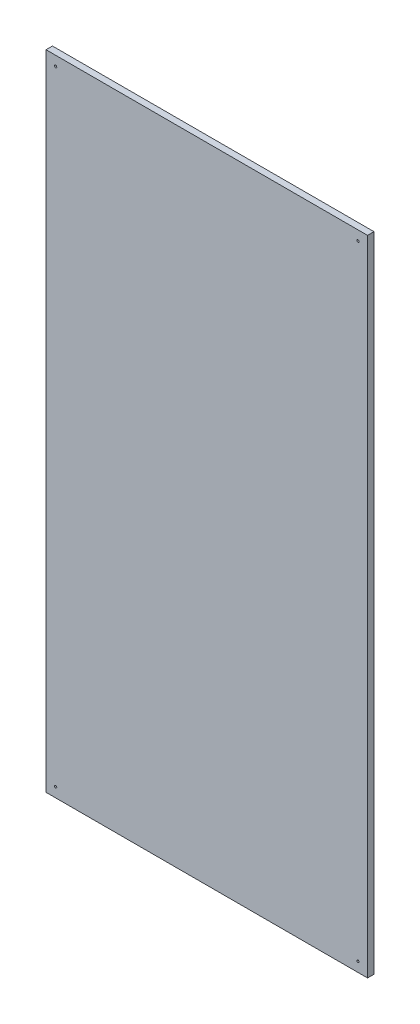
ISO-10303-21;
HEADER;
FILE_DESCRIPTION(('STEP AP214'),'2;1');
FILE_NAME('part.step','',(''),(''),'','','');
FILE_SCHEMA(('AUTOMOTIVE_DESIGN { 1 0 10303 214 1 1 1 1 }'));
ENDSEC;
DATA;
#1=APPLICATION_CONTEXT('core data for automotive mechanical design processes');
#2=APPLICATION_PROTOCOL_DEFINITION('international standard','automotive_design',2000,#1);
#3=PRODUCT_CONTEXT('',#1,'mechanical');
#4=PRODUCT('Part','Part','',(#3));
#5=PRODUCT_RELATED_PRODUCT_CATEGORY('part','',(#4));
#6=PRODUCT_DEFINITION_FORMATION('','',#4);
#7=PRODUCT_DEFINITION_CONTEXT('part definition',#1,'design');
#8=PRODUCT_DEFINITION('design','',#6,#7);
#9=PRODUCT_DEFINITION_SHAPE('','',#8);
#10=(LENGTH_UNIT() NAMED_UNIT(*) SI_UNIT(.MILLI.,.METRE.));
#11=(NAMED_UNIT(*) PLANE_ANGLE_UNIT() SI_UNIT($,.RADIAN.));
#12=(NAMED_UNIT(*) SI_UNIT($,.STERADIAN.) SOLID_ANGLE_UNIT());
#13=UNCERTAINTY_MEASURE_WITH_UNIT(LENGTH_MEASURE(1.E-05),#10,'distance_accuracy_value','');
#14=(GEOMETRIC_REPRESENTATION_CONTEXT(3) GLOBAL_UNCERTAINTY_ASSIGNED_CONTEXT((#13)) GLOBAL_UNIT_ASSIGNED_CONTEXT((#10,
#11,#12)) REPRESENTATION_CONTEXT('',''));
#15=CARTESIAN_POINT('',(0.,0.,0.));
#16=DIRECTION('',(0.,0.,1.));
#17=DIRECTION('',(1.,0.,0.));
#18=AXIS2_PLACEMENT_3D('',#15,#16,#17);
#19=CARTESIAN_POINT('',(0.,0.,10.));
#20=DIRECTION('',(0.,0.,1.));
#21=DIRECTION('',(1.,0.,0.));
#22=AXIS2_PLACEMENT_3D('',#19,#20,#21);
#23=PLANE('',#22);
#24=CARTESIAN_POINT('',(-235.,-485.,10.));
#25=DIRECTION('',(0.,0.,1.));
#26=DIRECTION('',(1.,0.,0.));
#27=AXIS2_PLACEMENT_3D('',#24,#25,#26);
#28=CIRCLE('',#27,1.75000000000001);
#29=CARTESIAN_POINT('',(-233.25,-485.,10.));
#30=VERTEX_POINT('',#29);
#31=EDGE_CURVE('E131',#30,#30,#28,.T.);
#32=ORIENTED_EDGE('',*,*,#31,.F.);
#33=EDGE_LOOP('',(#32));
#34=FACE_BOUND('',#33,.T.);
#35=CARTESIAN_POINT('',(235.,485.,10.));
#36=DIRECTION('',(0.,0.,1.));
#37=DIRECTION('',(1.,0.,0.));
#38=AXIS2_PLACEMENT_3D('',#35,#36,#37);
#39=CIRCLE('',#38,1.75000000000001);
#40=CARTESIAN_POINT('',(236.75,485.,10.));
#41=VERTEX_POINT('',#40);
#42=EDGE_CURVE('E110',#41,#41,#39,.T.);
#43=ORIENTED_EDGE('',*,*,#42,.F.);
#44=EDGE_LOOP('',(#43));
#45=FACE_BOUND('',#44,.T.);
#46=DIRECTION('',(0.,1.,0.));
#47=VECTOR('',#46,1.);
#48=CARTESIAN_POINT('',(250.,500.000000000001,10.));
#49=LINE('',#48,#47);
#50=CARTESIAN_POINT('',(250.,-499.999999999999,10.));
#51=VERTEX_POINT('',#50);
#52=CARTESIAN_POINT('',(250.,500.000000000001,10.));
#53=VERTEX_POINT('',#52);
#54=EDGE_CURVE('E95',#51,#53,#49,.T.);
#55=ORIENTED_EDGE('',*,*,#54,.T.);
#56=DIRECTION('',(-1.,0.,0.));
#57=VECTOR('',#56,1.);
#58=CARTESIAN_POINT('',(-250.,500.000000000001,10.));
#59=LINE('',#58,#57);
#60=CARTESIAN_POINT('',(-250.,500.000000000001,10.));
#61=VERTEX_POINT('',#60);
#62=EDGE_CURVE('E90',#53,#61,#59,.T.);
#63=ORIENTED_EDGE('',*,*,#62,.T.);
#64=DIRECTION('',(0.,-1.,0.));
#65=VECTOR('',#64,1.);
#66=CARTESIAN_POINT('',(-250.,500.000000000001,10.));
#67=LINE('',#66,#65);
#68=CARTESIAN_POINT('',(-250.,-499.999999999999,10.));
#69=VERTEX_POINT('',#68);
#70=EDGE_CURVE('E93',#61,#69,#67,.T.);
#71=ORIENTED_EDGE('',*,*,#70,.T.);
#72=DIRECTION('',(1.,0.,0.));
#73=VECTOR('',#72,1.);
#74=CARTESIAN_POINT('',(-250.,-499.999999999999,10.));
#75=LINE('',#74,#73);
#76=EDGE_CURVE('E60',#69,#51,#75,.T.);
#77=ORIENTED_EDGE('',*,*,#76,.T.);
#78=EDGE_LOOP('',(#55,#63,#71,#77));
#79=FACE_BOUND('',#78,.T.);
#80=CARTESIAN_POINT('',(235.,-485.,10.));
#81=DIRECTION('',(0.,0.,1.));
#82=DIRECTION('',(-1.,0.,0.));
#83=AXIS2_PLACEMENT_3D('',#80,#81,#82);
#84=CIRCLE('',#83,1.75000000000001);
#85=CARTESIAN_POINT('',(233.25,-485.,10.));
#86=VERTEX_POINT('',#85);
#87=EDGE_CURVE('E125',#86,#86,#84,.T.);
#88=ORIENTED_EDGE('',*,*,#87,.F.);
#89=EDGE_LOOP('',(#88));
#90=FACE_BOUND('',#89,.T.);
#91=CARTESIAN_POINT('',(-235.,485.,10.));
#92=DIRECTION('',(0.,0.,1.));
#93=DIRECTION('',(-1.,0.,0.));
#94=AXIS2_PLACEMENT_3D('',#91,#92,#93);
#95=CIRCLE('',#94,1.75000000000001);
#96=CARTESIAN_POINT('',(-236.75,485.,10.));
#97=VERTEX_POINT('',#96);
#98=EDGE_CURVE('E137',#97,#97,#95,.T.);
#99=ORIENTED_EDGE('',*,*,#98,.F.);
#100=EDGE_LOOP('',(#99));
#101=FACE_BOUND('',#100,.T.);
#102=ADVANCED_FACE('F43',(#34,#45,#79,#90,#101),#23,.T.);
#103=CARTESIAN_POINT('',(0.,0.,0.));
#104=DIRECTION('',(0.,0.,1.));
#105=DIRECTION('',(1.,0.,0.));
#106=AXIS2_PLACEMENT_3D('',#103,#104,#105);
#107=PLANE('',#106);
#108=DIRECTION('',(0.,1.,0.));
#109=VECTOR('',#108,1.);
#110=CARTESIAN_POINT('',(250.,500.000000000001,0.));
#111=LINE('',#110,#109);
#112=CARTESIAN_POINT('',(250.,-499.999999999999,0.));
#113=VERTEX_POINT('',#112);
#114=CARTESIAN_POINT('',(250.,500.000000000001,0.));
#115=VERTEX_POINT('',#114);
#116=EDGE_CURVE('E107',#113,#115,#111,.T.);
#117=ORIENTED_EDGE('',*,*,#116,.F.);
#118=DIRECTION('',(1.,0.,0.));
#119=VECTOR('',#118,1.);
#120=CARTESIAN_POINT('',(-250.,-499.999999999999,0.));
#121=LINE('',#120,#119);
#122=CARTESIAN_POINT('',(-250.,-499.999999999999,0.));
#123=VERTEX_POINT('',#122);
#124=EDGE_CURVE('E83',#123,#113,#121,.T.);
#125=ORIENTED_EDGE('',*,*,#124,.F.);
#126=DIRECTION('',(0.,-1.,0.));
#127=VECTOR('',#126,1.);
#128=CARTESIAN_POINT('',(-250.,500.000000000001,0.));
#129=LINE('',#128,#127);
#130=CARTESIAN_POINT('',(-250.,500.000000000001,0.));
#131=VERTEX_POINT('',#130);
#132=EDGE_CURVE('E77',#131,#123,#129,.T.);
#133=ORIENTED_EDGE('',*,*,#132,.F.);
#134=DIRECTION('',(-1.,0.,0.));
#135=VECTOR('',#134,1.);
#136=CARTESIAN_POINT('',(-250.,500.000000000001,0.));
#137=LINE('',#136,#135);
#138=EDGE_CURVE('E99',#115,#131,#137,.T.);
#139=ORIENTED_EDGE('',*,*,#138,.F.);
#140=EDGE_LOOP('',(#117,#125,#133,#139));
#141=FACE_BOUND('',#140,.T.);
#142=CARTESIAN_POINT('',(235.,485.,0.));
#143=DIRECTION('',(0.,0.,1.));
#144=DIRECTION('',(1.,0.,0.));
#145=AXIS2_PLACEMENT_3D('',#142,#143,#144);
#146=CIRCLE('',#145,1.75000000000001);
#147=CARTESIAN_POINT('',(236.75,485.,0.));
#148=VERTEX_POINT('',#147);
#149=EDGE_CURVE('E122',#148,#148,#146,.T.);
#150=ORIENTED_EDGE('',*,*,#149,.T.);
#151=EDGE_LOOP('',(#150));
#152=FACE_BOUND('',#151,.T.);
#153=CARTESIAN_POINT('',(235.,-485.,0.));
#154=DIRECTION('',(0.,0.,1.));
#155=DIRECTION('',(-1.,0.,0.));
#156=AXIS2_PLACEMENT_3D('',#153,#154,#155);
#157=CIRCLE('',#156,1.75000000000001);
#158=CARTESIAN_POINT('',(233.25,-485.,0.));
#159=VERTEX_POINT('',#158);
#160=EDGE_CURVE('E128',#159,#159,#157,.T.);
#161=ORIENTED_EDGE('',*,*,#160,.T.);
#162=EDGE_LOOP('',(#161));
#163=FACE_BOUND('',#162,.T.);
#164=CARTESIAN_POINT('',(-235.,-485.,0.));
#165=DIRECTION('',(0.,0.,1.));
#166=DIRECTION('',(1.,0.,0.));
#167=AXIS2_PLACEMENT_3D('',#164,#165,#166);
#168=CIRCLE('',#167,1.75000000000001);
#169=CARTESIAN_POINT('',(-233.25,-485.,0.));
#170=VERTEX_POINT('',#169);
#171=EDGE_CURVE('E134',#170,#170,#168,.T.);
#172=ORIENTED_EDGE('',*,*,#171,.T.);
#173=EDGE_LOOP('',(#172));
#174=FACE_BOUND('',#173,.T.);
#175=CARTESIAN_POINT('',(-235.,485.,0.));
#176=DIRECTION('',(0.,0.,1.));
#177=DIRECTION('',(-1.,0.,0.));
#178=AXIS2_PLACEMENT_3D('',#175,#176,#177);
#179=CIRCLE('',#178,1.75000000000001);
#180=CARTESIAN_POINT('',(-236.75,485.,0.));
#181=VERTEX_POINT('',#180);
#182=EDGE_CURVE('E140',#181,#181,#179,.T.);
#183=ORIENTED_EDGE('',*,*,#182,.T.);
#184=EDGE_LOOP('',(#183));
#185=FACE_BOUND('',#184,.T.);
#186=ADVANCED_FACE('F118',(#141,#152,#163,#174,#185),#107,.F.);
#187=CARTESIAN_POINT('',(250.,500.000000000001,10.));
#188=DIRECTION('',(-1.,0.,0.));
#189=DIRECTION('',(0.,-1.,0.));
#190=AXIS2_PLACEMENT_3D('',#187,#188,#189);
#191=PLANE('',#190);
#192=ORIENTED_EDGE('',*,*,#116,.T.);
#193=DIRECTION('',(0.,0.,-1.));
#194=VECTOR('',#193,1.);
#195=CARTESIAN_POINT('',(250.,500.000000000001,10.));
#196=LINE('',#195,#194);
#197=EDGE_CURVE('E11',#53,#115,#196,.T.);
#198=ORIENTED_EDGE('',*,*,#197,.F.);
#199=ORIENTED_EDGE('',*,*,#54,.F.);
#200=DIRECTION('',(0.,0.,-1.));
#201=VECTOR('',#200,1.);
#202=CARTESIAN_POINT('',(250.,-499.999999999999,10.));
#203=LINE('',#202,#201);
#204=EDGE_CURVE('E103',#51,#113,#203,.T.);
#205=ORIENTED_EDGE('',*,*,#204,.T.);
#206=EDGE_LOOP('',(#192,#198,#199,#205));
#207=FACE_BOUND('',#206,.T.);
#208=ADVANCED_FACE('F45',(#207),#191,.F.);
#209=CARTESIAN_POINT('',(-250.,500.000000000001,10.));
#210=DIRECTION('',(0.,-1.,0.));
#211=DIRECTION('',(0.,0.,-1.));
#212=AXIS2_PLACEMENT_3D('',#209,#210,#211);
#213=PLANE('',#212);
#214=ORIENTED_EDGE('',*,*,#138,.T.);
#215=DIRECTION('',(0.,0.,-1.));
#216=VECTOR('',#215,1.);
#217=CARTESIAN_POINT('',(-250.,500.000000000001,10.));
#218=LINE('',#217,#216);
#219=EDGE_CURVE('E52',#61,#131,#218,.T.);
#220=ORIENTED_EDGE('',*,*,#219,.F.);
#221=ORIENTED_EDGE('',*,*,#62,.F.);
#222=ORIENTED_EDGE('',*,*,#197,.T.);
#223=EDGE_LOOP('',(#214,#220,#221,#222));
#224=FACE_BOUND('',#223,.T.);
#225=ADVANCED_FACE('F98',(#224),#213,.F.);
#226=CARTESIAN_POINT('',(-250.,500.000000000001,10.));
#227=DIRECTION('',(1.,0.,0.));
#228=DIRECTION('',(0.,1.,0.));
#229=AXIS2_PLACEMENT_3D('',#226,#227,#228);
#230=PLANE('',#229);
#231=ORIENTED_EDGE('',*,*,#132,.T.);
#232=DIRECTION('',(0.,0.,-1.));
#233=VECTOR('',#232,1.);
#234=CARTESIAN_POINT('',(-250.,-499.999999999999,10.));
#235=LINE('',#234,#233);
#236=EDGE_CURVE('E100',#69,#123,#235,.T.);
#237=ORIENTED_EDGE('',*,*,#236,.F.);
#238=ORIENTED_EDGE('',*,*,#70,.F.);
#239=ORIENTED_EDGE('',*,*,#219,.T.);
#240=EDGE_LOOP('',(#231,#237,#238,#239));
#241=FACE_BOUND('',#240,.T.);
#242=ADVANCED_FACE('F101',(#241),#230,.F.);
#243=CARTESIAN_POINT('',(-250.,-499.999999999999,10.));
#244=DIRECTION('',(0.,1.,0.));
#245=DIRECTION('',(0.,0.,1.));
#246=AXIS2_PLACEMENT_3D('',#243,#244,#245);
#247=PLANE('',#246);
#248=ORIENTED_EDGE('',*,*,#124,.T.);
#249=ORIENTED_EDGE('',*,*,#204,.F.);
#250=ORIENTED_EDGE('',*,*,#76,.F.);
#251=ORIENTED_EDGE('',*,*,#236,.T.);
#252=EDGE_LOOP('',(#248,#249,#250,#251));
#253=FACE_BOUND('',#252,.T.);
#254=ADVANCED_FACE('F115',(#253),#247,.F.);
#255=CARTESIAN_POINT('',(235.,485.,10.));
#256=DIRECTION('',(0.,0.,-1.));
#257=DIRECTION('',(-1.,0.,0.));
#258=AXIS2_PLACEMENT_3D('',#255,#256,#257);
#259=CYLINDRICAL_SURFACE('',#258,1.75000000000001);
#260=ORIENTED_EDGE('',*,*,#42,.T.);
#261=EDGE_LOOP('',(#260));
#262=FACE_BOUND('',#261,.T.);
#263=ORIENTED_EDGE('',*,*,#149,.F.);
#264=EDGE_LOOP('',(#263));
#265=FACE_BOUND('',#264,.T.);
#266=ADVANCED_FACE('F159',(#262,#265),#259,.F.);
#267=CARTESIAN_POINT('',(235.,-485.,10.));
#268=DIRECTION('',(0.,0.,-1.));
#269=DIRECTION('',(-1.,0.,0.));
#270=AXIS2_PLACEMENT_3D('',#267,#268,#269);
#271=CYLINDRICAL_SURFACE('',#270,1.75000000000001);
#272=ORIENTED_EDGE('',*,*,#87,.T.);
#273=EDGE_LOOP('',(#272));
#274=FACE_BOUND('',#273,.T.);
#275=ORIENTED_EDGE('',*,*,#160,.F.);
#276=EDGE_LOOP('',(#275));
#277=FACE_BOUND('',#276,.T.);
#278=ADVANCED_FACE('F204',(#274,#277),#271,.F.);
#279=CARTESIAN_POINT('',(-235.,-485.,10.));
#280=DIRECTION('',(0.,0.,-1.));
#281=DIRECTION('',(-1.,0.,0.));
#282=AXIS2_PLACEMENT_3D('',#279,#280,#281);
#283=CYLINDRICAL_SURFACE('',#282,1.75000000000001);
#284=ORIENTED_EDGE('',*,*,#31,.T.);
#285=EDGE_LOOP('',(#284));
#286=FACE_BOUND('',#285,.T.);
#287=ORIENTED_EDGE('',*,*,#171,.F.);
#288=EDGE_LOOP('',(#287));
#289=FACE_BOUND('',#288,.T.);
#290=ADVANCED_FACE('F212',(#286,#289),#283,.F.);
#291=CARTESIAN_POINT('',(-235.,485.,10.));
#292=DIRECTION('',(0.,0.,-1.));
#293=DIRECTION('',(-1.,0.,0.));
#294=AXIS2_PLACEMENT_3D('',#291,#292,#293);
#295=CYLINDRICAL_SURFACE('',#294,1.75000000000001);
#296=ORIENTED_EDGE('',*,*,#98,.T.);
#297=EDGE_LOOP('',(#296));
#298=FACE_BOUND('',#297,.T.);
#299=ORIENTED_EDGE('',*,*,#182,.F.);
#300=EDGE_LOOP('',(#299));
#301=FACE_BOUND('',#300,.T.);
#302=ADVANCED_FACE('F146',(#298,#301),#295,.F.);
#303=CLOSED_SHELL('',(#102,#186,#208,#225,#242,#254,#266,#278,#290,#302));
#304=MANIFOLD_SOLID_BREP('B2',#303);
#305=ADVANCED_BREP_SHAPE_REPRESENTATION('',(#18,#304),#14);
#306=SHAPE_DEFINITION_REPRESENTATION(#9,#305);
ENDSEC;
END-ISO-10303-21;
